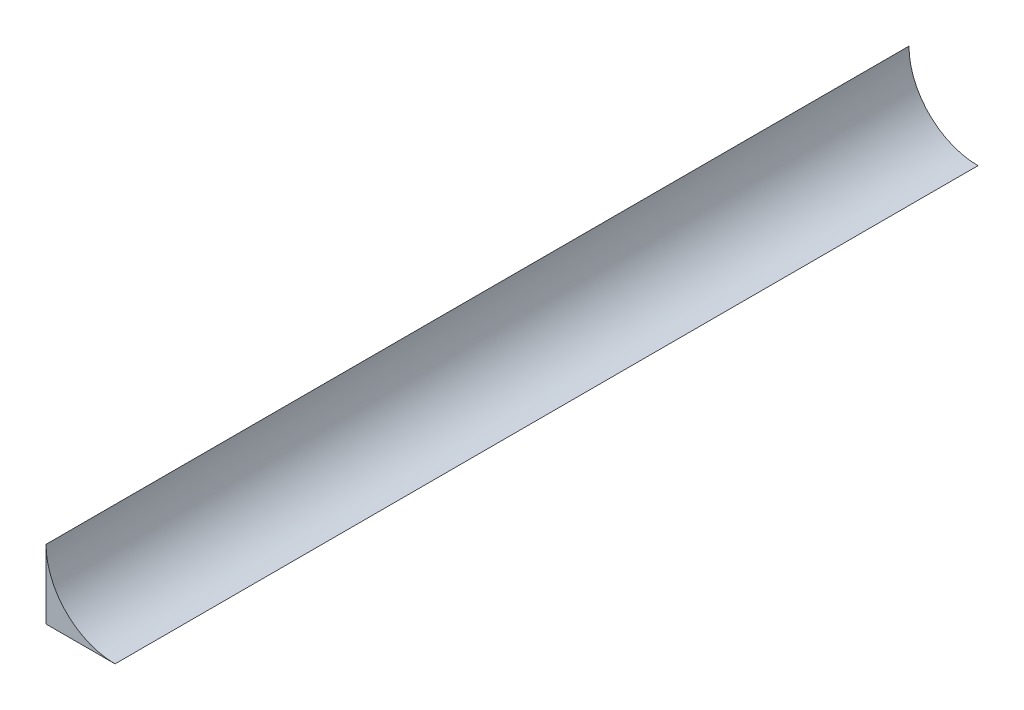
ISO-10303-21;
HEADER;
FILE_DESCRIPTION(('STEP AP214'),'2;1');
FILE_NAME('part.step','',(''),(''),'','','');
FILE_SCHEMA(('AUTOMOTIVE_DESIGN { 1 0 10303 214 1 1 1 1 }'));
ENDSEC;
DATA;
#1=APPLICATION_CONTEXT('core data for automotive mechanical design processes');
#2=APPLICATION_PROTOCOL_DEFINITION('international standard','automotive_design',2000,#1);
#3=PRODUCT_CONTEXT('',#1,'mechanical');
#4=PRODUCT('Part','Part','',(#3));
#5=PRODUCT_RELATED_PRODUCT_CATEGORY('part','',(#4));
#6=PRODUCT_DEFINITION_FORMATION('','',#4);
#7=PRODUCT_DEFINITION_CONTEXT('part definition',#1,'design');
#8=PRODUCT_DEFINITION('design','',#6,#7);
#9=PRODUCT_DEFINITION_SHAPE('','',#8);
#10=(LENGTH_UNIT() NAMED_UNIT(*) SI_UNIT(.MILLI.,.METRE.));
#11=(NAMED_UNIT(*) PLANE_ANGLE_UNIT() SI_UNIT($,.RADIAN.));
#12=(NAMED_UNIT(*) SI_UNIT($,.STERADIAN.) SOLID_ANGLE_UNIT());
#13=UNCERTAINTY_MEASURE_WITH_UNIT(LENGTH_MEASURE(1.E-05),#10,'distance_accuracy_value','');
#14=(GEOMETRIC_REPRESENTATION_CONTEXT(3) GLOBAL_UNCERTAINTY_ASSIGNED_CONTEXT((#13)) GLOBAL_UNIT_ASSIGNED_CONTEXT((#10,
#11,#12)) REPRESENTATION_CONTEXT('',''));
#15=CARTESIAN_POINT('',(0.,0.,0.));
#16=DIRECTION('',(0.,0.,1.));
#17=DIRECTION('',(1.,0.,0.));
#18=AXIS2_PLACEMENT_3D('',#15,#16,#17);
#19=CARTESIAN_POINT('',(12.7,12.7,79.375));
#20=DIRECTION('',(0.,0.,-1.));
#21=DIRECTION('',(-1.,0.,0.));
#22=AXIS2_PLACEMENT_3D('',#19,#20,#21);
#23=CYLINDRICAL_SURFACE('',#22,12.7);
#24=CARTESIAN_POINT('',(12.7,12.7,-79.375));
#25=DIRECTION('',(0.,0.,-1.));
#26=DIRECTION('',(-1.,0.,0.));
#27=AXIS2_PLACEMENT_3D('',#24,#25,#26);
#28=CIRCLE('',#27,12.7);
#29=CARTESIAN_POINT('',(12.7,0.,-79.375));
#30=VERTEX_POINT('',#29);
#31=CARTESIAN_POINT('',(0.,12.7,-79.375));
#32=VERTEX_POINT('',#31);
#33=EDGE_CURVE('E78',#30,#32,#28,.T.);
#34=ORIENTED_EDGE('',*,*,#33,.T.);
#35=DIRECTION('',(0.,0.,-1.));
#36=VECTOR('',#35,1.);
#37=CARTESIAN_POINT('',(0.,12.7,79.375));
#38=LINE('',#37,#36);
#39=CARTESIAN_POINT('',(0.,12.7,79.375));
#40=VERTEX_POINT('',#39);
#41=EDGE_CURVE('E11',#40,#32,#38,.T.);
#42=ORIENTED_EDGE('',*,*,#41,.F.);
#43=CARTESIAN_POINT('',(12.7,12.7,79.375));
#44=DIRECTION('',(0.,0.,-1.));
#45=DIRECTION('',(-1.,0.,0.));
#46=AXIS2_PLACEMENT_3D('',#43,#44,#45);
#47=CIRCLE('',#46,12.7);
#48=CARTESIAN_POINT('',(12.7,0.,79.375));
#49=VERTEX_POINT('',#48);
#50=EDGE_CURVE('E71',#49,#40,#47,.T.);
#51=ORIENTED_EDGE('',*,*,#50,.F.);
#52=DIRECTION('',(0.,0.,-1.));
#53=VECTOR('',#52,1.);
#54=CARTESIAN_POINT('',(12.7,0.,79.375));
#55=LINE('',#54,#53);
#56=EDGE_CURVE('E79',#49,#30,#55,.T.);
#57=ORIENTED_EDGE('',*,*,#56,.T.);
#58=EDGE_LOOP('',(#34,#42,#51,#57));
#59=FACE_BOUND('',#58,.T.);
#60=ADVANCED_FACE('F31',(#59),#23,.F.);
#61=CARTESIAN_POINT('',(0.,12.7,79.375));
#62=DIRECTION('',(1.,0.,0.));
#63=DIRECTION('',(0.,0.,-1.));
#64=AXIS2_PLACEMENT_3D('',#61,#62,#63);
#65=PLANE('',#64);
#66=DIRECTION('',(0.,-1.,0.));
#67=VECTOR('',#66,1.);
#68=CARTESIAN_POINT('',(0.,12.7,-79.375));
#69=LINE('',#68,#67);
#70=CARTESIAN_POINT('',(0.,0.,-79.375));
#71=VERTEX_POINT('',#70);
#72=EDGE_CURVE('E59',#32,#71,#69,.T.);
#73=ORIENTED_EDGE('',*,*,#72,.T.);
#74=DIRECTION('',(0.,0.,-1.));
#75=VECTOR('',#74,1.);
#76=CARTESIAN_POINT('',(0.,0.,79.375));
#77=LINE('',#76,#75);
#78=CARTESIAN_POINT('',(0.,0.,79.375));
#79=VERTEX_POINT('',#78);
#80=EDGE_CURVE('E39',#79,#71,#77,.T.);
#81=ORIENTED_EDGE('',*,*,#80,.F.);
#82=DIRECTION('',(0.,-1.,0.));
#83=VECTOR('',#82,1.);
#84=CARTESIAN_POINT('',(0.,12.7,79.375));
#85=LINE('',#84,#83);
#86=EDGE_CURVE('E67',#40,#79,#85,.T.);
#87=ORIENTED_EDGE('',*,*,#86,.F.);
#88=ORIENTED_EDGE('',*,*,#41,.T.);
#89=EDGE_LOOP('',(#73,#81,#87,#88));
#90=FACE_BOUND('',#89,.T.);
#91=ADVANCED_FACE('F68',(#90),#65,.F.);
#92=CARTESIAN_POINT('',(0.,0.,79.375));
#93=DIRECTION('',(0.,1.,0.));
#94=DIRECTION('',(0.,0.,1.));
#95=AXIS2_PLACEMENT_3D('',#92,#93,#94);
#96=PLANE('',#95);
#97=DIRECTION('',(1.,0.,0.));
#98=VECTOR('',#97,1.);
#99=CARTESIAN_POINT('',(0.,0.,-79.375));
#100=LINE('',#99,#98);
#101=EDGE_CURVE('E64',#71,#30,#100,.T.);
#102=ORIENTED_EDGE('',*,*,#101,.T.);
#103=ORIENTED_EDGE('',*,*,#56,.F.);
#104=DIRECTION('',(1.,0.,0.));
#105=VECTOR('',#104,1.);
#106=CARTESIAN_POINT('',(0.,0.,79.375));
#107=LINE('',#106,#105);
#108=EDGE_CURVE('E47',#79,#49,#107,.T.);
#109=ORIENTED_EDGE('',*,*,#108,.F.);
#110=ORIENTED_EDGE('',*,*,#80,.T.);
#111=EDGE_LOOP('',(#102,#103,#109,#110));
#112=FACE_BOUND('',#111,.T.);
#113=ADVANCED_FACE('F86',(#112),#96,.F.);
#114=CARTESIAN_POINT('',(12.7,12.7,79.375));
#115=DIRECTION('',(0.,0.,-1.));
#116=DIRECTION('',(-1.,0.,0.));
#117=AXIS2_PLACEMENT_3D('',#114,#115,#116);
#118=PLANE('',#117);
#119=ORIENTED_EDGE('',*,*,#50,.T.);
#120=ORIENTED_EDGE('',*,*,#86,.T.);
#121=ORIENTED_EDGE('',*,*,#108,.T.);
#122=EDGE_LOOP('',(#119,#120,#121));
#123=FACE_BOUND('',#122,.T.);
#124=ADVANCED_FACE('F74',(#123),#118,.F.);
#125=CARTESIAN_POINT('',(12.7,12.7,-79.375));
#126=DIRECTION('',(0.,0.,-1.));
#127=DIRECTION('',(-1.,0.,0.));
#128=AXIS2_PLACEMENT_3D('',#125,#126,#127);
#129=PLANE('',#128);
#130=ORIENTED_EDGE('',*,*,#33,.F.);
#131=ORIENTED_EDGE('',*,*,#101,.F.);
#132=ORIENTED_EDGE('',*,*,#72,.F.);
#133=EDGE_LOOP('',(#130,#131,#132));
#134=FACE_BOUND('',#133,.T.);
#135=ADVANCED_FACE('F87',(#134),#129,.T.);
#136=CLOSED_SHELL('',(#60,#91,#113,#124,#135));
#137=MANIFOLD_SOLID_BREP('B2',#136);
#138=ADVANCED_BREP_SHAPE_REPRESENTATION('',(#18,#137),#14);
#139=SHAPE_DEFINITION_REPRESENTATION(#9,#138);
ENDSEC;
END-ISO-10303-21;
